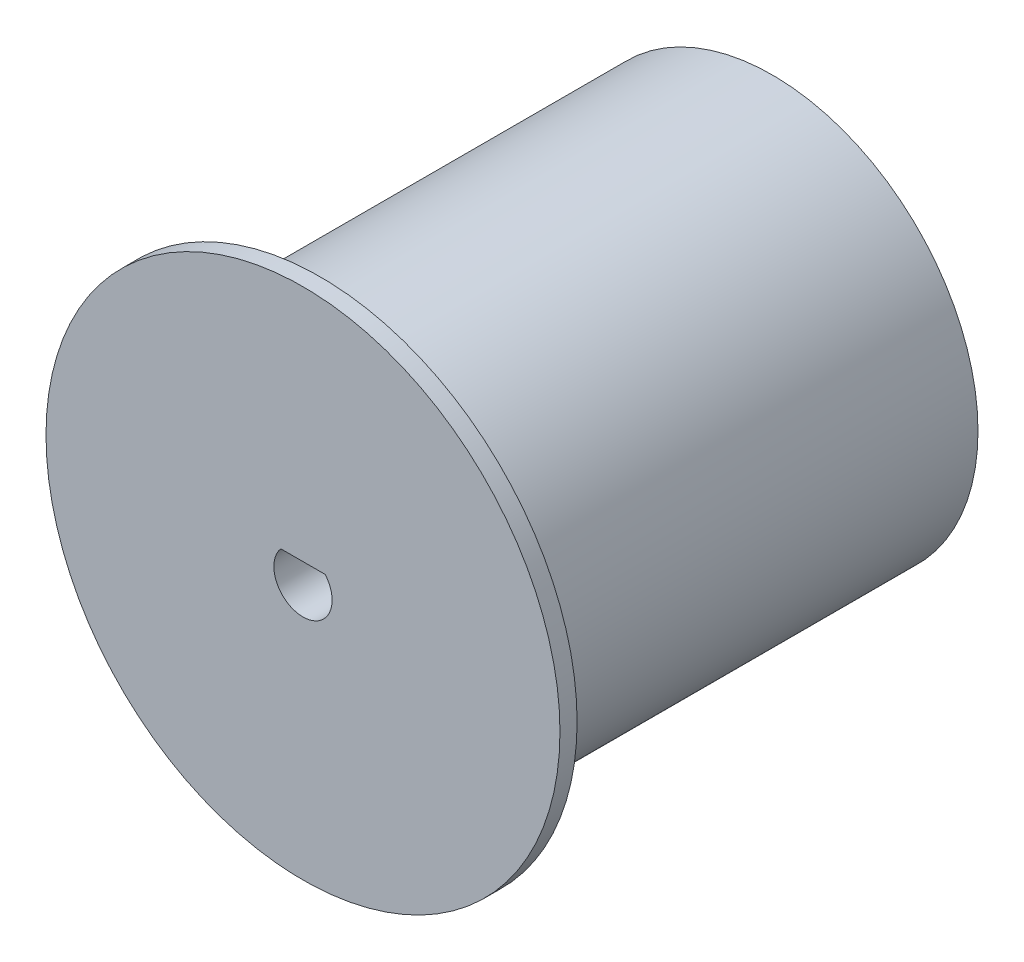
ISO-10303-21;
HEADER;
FILE_DESCRIPTION(('STEP AP214'),'2;1');
FILE_NAME('part.step','',(''),(''),'','','');
FILE_SCHEMA(('AUTOMOTIVE_DESIGN { 1 0 10303 214 1 1 1 1 }'));
ENDSEC;
DATA;
#1=APPLICATION_CONTEXT('core data for automotive mechanical design processes');
#2=APPLICATION_PROTOCOL_DEFINITION('international standard','automotive_design',2000,#1);
#3=PRODUCT_CONTEXT('',#1,'mechanical');
#4=PRODUCT('Part','Part','',(#3));
#5=PRODUCT_RELATED_PRODUCT_CATEGORY('part','',(#4));
#6=PRODUCT_DEFINITION_FORMATION('','',#4);
#7=PRODUCT_DEFINITION_CONTEXT('part definition',#1,'design');
#8=PRODUCT_DEFINITION('design','',#6,#7);
#9=PRODUCT_DEFINITION_SHAPE('','',#8);
#10=(LENGTH_UNIT() NAMED_UNIT(*) SI_UNIT(.MILLI.,.METRE.));
#11=(NAMED_UNIT(*) PLANE_ANGLE_UNIT() SI_UNIT($,.RADIAN.));
#12=(NAMED_UNIT(*) SI_UNIT($,.STERADIAN.) SOLID_ANGLE_UNIT());
#13=UNCERTAINTY_MEASURE_WITH_UNIT(LENGTH_MEASURE(1.E-05),#10,'distance_accuracy_value','');
#14=(GEOMETRIC_REPRESENTATION_CONTEXT(3) GLOBAL_UNCERTAINTY_ASSIGNED_CONTEXT((#13)) GLOBAL_UNIT_ASSIGNED_CONTEXT((#10,
#11,#12)) REPRESENTATION_CONTEXT('',''));
#15=CARTESIAN_POINT('',(0.,0.,0.));
#16=DIRECTION('',(0.,0.,1.));
#17=DIRECTION('',(1.,0.,0.));
#18=AXIS2_PLACEMENT_3D('',#15,#16,#17);
#19=CARTESIAN_POINT('',(0.,0.,0.));
#20=DIRECTION('',(0.,0.,1.));
#21=DIRECTION('',(1.,0.,0.));
#22=AXIS2_PLACEMENT_3D('',#19,#20,#21);
#23=PLANE('',#22);
#24=CARTESIAN_POINT('',(0.,0.,0.));
#25=DIRECTION('',(0.,0.,1.));
#26=DIRECTION('',(1.,0.,0.));
#27=AXIS2_PLACEMENT_3D('',#24,#25,#26);
#28=CIRCLE('',#27,15.);
#29=CARTESIAN_POINT('',(15.,0.,0.));
#30=VERTEX_POINT('',#29);
#31=EDGE_CURVE('E86',#30,#30,#28,.T.);
#32=ORIENTED_EDGE('',*,*,#31,.T.);
#33=EDGE_LOOP('',(#32));
#34=FACE_BOUND('',#33,.T.);
#35=CARTESIAN_POINT('',(0.,0.,0.));
#36=DIRECTION('',(0.,0.,1.));
#37=DIRECTION('',(1.,0.,0.));
#38=AXIS2_PLACEMENT_3D('',#35,#36,#37);
#39=CIRCLE('',#38,1.7);
#40=CARTESIAN_POINT('',(-1.29614813968157,1.1,0.));
#41=VERTEX_POINT('',#40);
#42=CARTESIAN_POINT('',(1.29614813968157,1.1,0.));
#43=VERTEX_POINT('',#42);
#44=EDGE_CURVE('E65',#41,#43,#39,.T.);
#45=ORIENTED_EDGE('',*,*,#44,.F.);
#46=DIRECTION('',(1.,0.,0.));
#47=VECTOR('',#46,1.);
#48=CARTESIAN_POINT('',(0.,1.1,0.));
#49=LINE('',#48,#47);
#50=EDGE_CURVE('E47',#41,#43,#49,.T.);
#51=ORIENTED_EDGE('',*,*,#50,.T.);
#52=EDGE_LOOP('',(#45,#51));
#53=FACE_BOUND('',#52,.T.);
#54=ADVANCED_FACE('F33',(#34,#53),#23,.T.);
#55=CARTESIAN_POINT('',(9.25,0.,-7.4));
#56=DIRECTION('',(0.,0.,-1.));
#57=DIRECTION('',(-1.,0.,0.));
#58=AXIS2_PLACEMENT_3D('',#55,#56,#57);
#59=PLANE('',#58);
#60=CARTESIAN_POINT('',(0.,0.,-7.4));
#61=DIRECTION('',(0.,0.,1.));
#62=DIRECTION('',(1.,0.,0.));
#63=AXIS2_PLACEMENT_3D('',#60,#61,#62);
#64=CIRCLE('',#63,9.25);
#65=CARTESIAN_POINT('',(9.25,0.,-7.4));
#66=VERTEX_POINT('',#65);
#67=EDGE_CURVE('E61',#66,#66,#64,.T.);
#68=ORIENTED_EDGE('',*,*,#67,.F.);
#69=EDGE_LOOP('',(#68));
#70=FACE_BOUND('',#69,.T.);
#71=CARTESIAN_POINT('',(0.,0.,-7.4));
#72=DIRECTION('',(0.,0.,-1.));
#73=DIRECTION('',(-1.,0.,0.));
#74=AXIS2_PLACEMENT_3D('',#71,#72,#73);
#75=CIRCLE('',#74,1.7);
#76=CARTESIAN_POINT('',(1.29614813968157,1.1,-7.4));
#77=VERTEX_POINT('',#76);
#78=CARTESIAN_POINT('',(-1.29614813968157,1.1,-7.4));
#79=VERTEX_POINT('',#78);
#80=EDGE_CURVE('E40',#77,#79,#75,.T.);
#81=ORIENTED_EDGE('',*,*,#80,.F.);
#82=DIRECTION('',(-1.,0.,0.));
#83=VECTOR('',#82,1.);
#84=CARTESIAN_POINT('',(9.25,1.1,-7.4));
#85=LINE('',#84,#83);
#86=EDGE_CURVE('E11',#77,#79,#85,.T.);
#87=ORIENTED_EDGE('',*,*,#86,.T.);
#88=EDGE_LOOP('',(#81,#87));
#89=FACE_BOUND('',#88,.T.);
#90=ADVANCED_FACE('F89',(#70,#89),#59,.T.);
#91=CARTESIAN_POINT('',(0.,0.,0.));
#92=DIRECTION('',(0.,0.,1.));
#93=DIRECTION('',(1.,0.,0.));
#94=AXIS2_PLACEMENT_3D('',#91,#92,#93);
#95=CYLINDRICAL_SURFACE('',#94,15.);
#96=CARTESIAN_POINT('',(0.,0.,-1.));
#97=DIRECTION('',(0.,0.,1.));
#98=DIRECTION('',(1.,0.,0.));
#99=AXIS2_PLACEMENT_3D('',#96,#97,#98);
#100=CIRCLE('',#99,15.);
#101=CARTESIAN_POINT('',(15.,0.,-1.));
#102=VERTEX_POINT('',#101);
#103=EDGE_CURVE('E83',#102,#102,#100,.T.);
#104=ORIENTED_EDGE('',*,*,#103,.T.);
#105=EDGE_LOOP('',(#104));
#106=FACE_BOUND('',#105,.T.);
#107=ORIENTED_EDGE('',*,*,#31,.F.);
#108=EDGE_LOOP('',(#107));
#109=FACE_BOUND('',#108,.T.);
#110=ADVANCED_FACE('F91',(#106,#109),#95,.T.);
#111=CARTESIAN_POINT('',(15.,0.,-1.));
#112=DIRECTION('',(0.,0.,-1.));
#113=DIRECTION('',(-1.,0.,0.));
#114=AXIS2_PLACEMENT_3D('',#111,#112,#113);
#115=PLANE('',#114);
#116=CARTESIAN_POINT('',(0.,0.,-1.));
#117=DIRECTION('',(0.,0.,1.));
#118=DIRECTION('',(1.,0.,0.));
#119=AXIS2_PLACEMENT_3D('',#116,#117,#118);
#120=CIRCLE('',#119,12.);
#121=CARTESIAN_POINT('',(12.,0.,-1.));
#122=VERTEX_POINT('',#121);
#123=EDGE_CURVE('E80',#122,#122,#120,.T.);
#124=ORIENTED_EDGE('',*,*,#123,.T.);
#125=EDGE_LOOP('',(#124));
#126=FACE_BOUND('',#125,.T.);
#127=ORIENTED_EDGE('',*,*,#103,.F.);
#128=EDGE_LOOP('',(#127));
#129=FACE_BOUND('',#128,.T.);
#130=ADVANCED_FACE('F98',(#126,#129),#115,.T.);
#131=CARTESIAN_POINT('',(0.,0.,0.));
#132=DIRECTION('',(0.,0.,1.));
#133=DIRECTION('',(1.,0.,0.));
#134=AXIS2_PLACEMENT_3D('',#131,#132,#133);
#135=CYLINDRICAL_SURFACE('',#134,12.);
#136=CARTESIAN_POINT('',(0.,0.,-27.4));
#137=DIRECTION('',(0.,0.,1.));
#138=DIRECTION('',(1.,0.,0.));
#139=AXIS2_PLACEMENT_3D('',#136,#137,#138);
#140=CIRCLE('',#139,12.);
#141=CARTESIAN_POINT('',(12.,0.,-27.4));
#142=VERTEX_POINT('',#141);
#143=EDGE_CURVE('E77',#142,#142,#140,.T.);
#144=ORIENTED_EDGE('',*,*,#143,.T.);
#145=EDGE_LOOP('',(#144));
#146=FACE_BOUND('',#145,.T.);
#147=ORIENTED_EDGE('',*,*,#123,.F.);
#148=EDGE_LOOP('',(#147));
#149=FACE_BOUND('',#148,.T.);
#150=ADVANCED_FACE('F112',(#146,#149),#135,.T.);
#151=CARTESIAN_POINT('',(12.,0.,-27.4));
#152=DIRECTION('',(0.,0.,-1.));
#153=DIRECTION('',(-1.,0.,0.));
#154=AXIS2_PLACEMENT_3D('',#151,#152,#153);
#155=PLANE('',#154);
#156=CARTESIAN_POINT('',(0.,0.,-27.4));
#157=DIRECTION('',(0.,0.,1.));
#158=DIRECTION('',(1.,0.,0.));
#159=AXIS2_PLACEMENT_3D('',#156,#157,#158);
#160=CIRCLE('',#159,9.25);
#161=CARTESIAN_POINT('',(9.25,0.,-27.4));
#162=VERTEX_POINT('',#161);
#163=EDGE_CURVE('E74',#162,#162,#160,.T.);
#164=ORIENTED_EDGE('',*,*,#163,.T.);
#165=EDGE_LOOP('',(#164));
#166=FACE_BOUND('',#165,.T.);
#167=ORIENTED_EDGE('',*,*,#143,.F.);
#168=EDGE_LOOP('',(#167));
#169=FACE_BOUND('',#168,.T.);
#170=ADVANCED_FACE('F108',(#166,#169),#155,.T.);
#171=CARTESIAN_POINT('',(0.,0.,0.));
#172=DIRECTION('',(0.,0.,1.));
#173=DIRECTION('',(1.,0.,0.));
#174=AXIS2_PLACEMENT_3D('',#171,#172,#173);
#175=CYLINDRICAL_SURFACE('',#174,9.25);
#176=ORIENTED_EDGE('',*,*,#67,.T.);
#177=EDGE_LOOP('',(#176));
#178=FACE_BOUND('',#177,.T.);
#179=ORIENTED_EDGE('',*,*,#163,.F.);
#180=EDGE_LOOP('',(#179));
#181=FACE_BOUND('',#180,.T.);
#182=ADVANCED_FACE('F105',(#178,#181),#175,.F.);
#183=CARTESIAN_POINT('',(0.,1.1,-10.));
#184=DIRECTION('',(0.,-1.,0.));
#185=DIRECTION('',(0.,0.,-1.));
#186=AXIS2_PLACEMENT_3D('',#183,#184,#185);
#187=PLANE('',#186);
#188=DIRECTION('',(0.,0.,1.));
#189=VECTOR('',#188,1.);
#190=CARTESIAN_POINT('',(1.29614813968157,1.1,-10.));
#191=LINE('',#190,#189);
#192=EDGE_CURVE('E54',#77,#43,#191,.T.);
#193=ORIENTED_EDGE('',*,*,#192,.T.);
#194=ORIENTED_EDGE('',*,*,#50,.F.);
#195=DIRECTION('',(0.,0.,1.));
#196=VECTOR('',#195,1.);
#197=CARTESIAN_POINT('',(-1.29614813968157,1.1,-10.));
#198=LINE('',#197,#196);
#199=EDGE_CURVE('E62',#79,#41,#198,.T.);
#200=ORIENTED_EDGE('',*,*,#199,.F.);
#201=ORIENTED_EDGE('',*,*,#86,.F.);
#202=EDGE_LOOP('',(#193,#194,#200,#201));
#203=FACE_BOUND('',#202,.T.);
#204=ADVANCED_FACE('F59',(#203),#187,.T.);
#205=CARTESIAN_POINT('',(0.,0.,-10.));
#206=DIRECTION('',(0.,0.,1.));
#207=DIRECTION('',(1.,0.,0.));
#208=AXIS2_PLACEMENT_3D('',#205,#206,#207);
#209=CYLINDRICAL_SURFACE('',#208,1.7);
#210=ORIENTED_EDGE('',*,*,#80,.T.);
#211=ORIENTED_EDGE('',*,*,#199,.T.);
#212=ORIENTED_EDGE('',*,*,#44,.T.);
#213=ORIENTED_EDGE('',*,*,#192,.F.);
#214=EDGE_LOOP('',(#210,#211,#212,#213));
#215=FACE_BOUND('',#214,.T.);
#216=ADVANCED_FACE('F66',(#215),#209,.F.);
#217=CLOSED_SHELL('',(#54,#90,#110,#130,#150,#170,#182,#204,#216));
#218=MANIFOLD_SOLID_BREP('B2',#217);
#219=ADVANCED_BREP_SHAPE_REPRESENTATION('',(#18,#218),#14);
#220=SHAPE_DEFINITION_REPRESENTATION(#9,#219);
ENDSEC;
END-ISO-10303-21;
